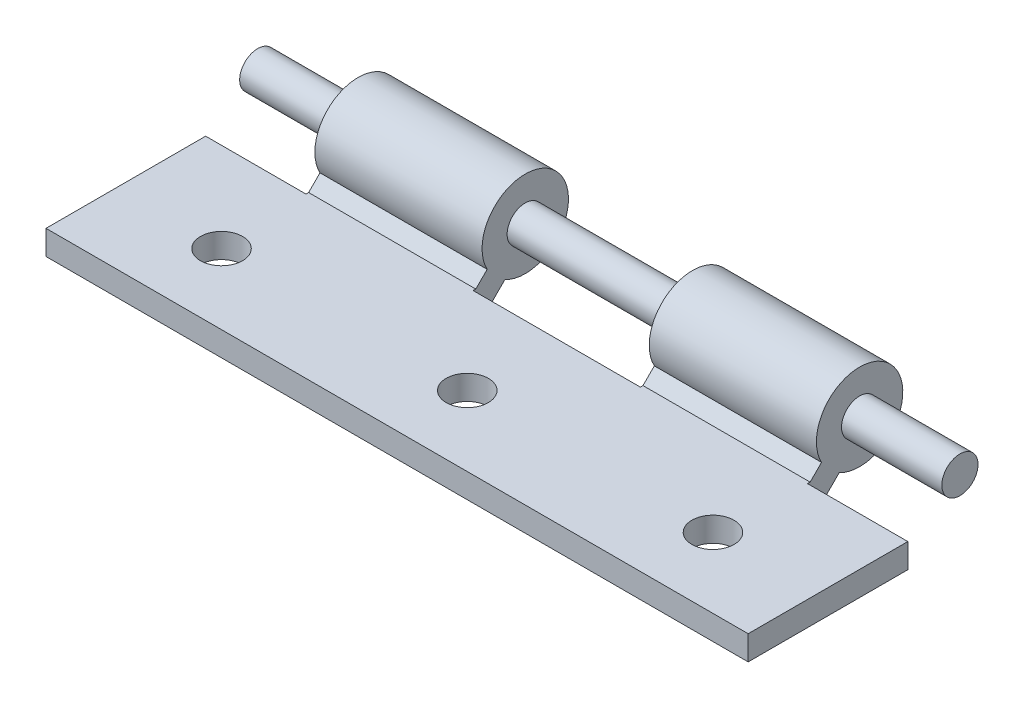
ISO-10303-21;
HEADER;
FILE_DESCRIPTION(('STEP AP214'),'2;1');
FILE_NAME('part.step','',(''),(''),'','','');
FILE_SCHEMA(('AUTOMOTIVE_DESIGN { 1 0 10303 214 1 1 1 1 }'));
ENDSEC;
DATA;
#1=APPLICATION_CONTEXT('core data for automotive mechanical design processes');
#2=APPLICATION_PROTOCOL_DEFINITION('international standard','automotive_design',2000,#1);
#3=PRODUCT_CONTEXT('',#1,'mechanical');
#4=PRODUCT('Part','Part','',(#3));
#5=PRODUCT_RELATED_PRODUCT_CATEGORY('part','',(#4));
#6=PRODUCT_DEFINITION_FORMATION('','',#4);
#7=PRODUCT_DEFINITION_CONTEXT('part definition',#1,'design');
#8=PRODUCT_DEFINITION('design','',#6,#7);
#9=PRODUCT_DEFINITION_SHAPE('','',#8);
#10=(LENGTH_UNIT() NAMED_UNIT(*) SI_UNIT(.MILLI.,.METRE.));
#11=(NAMED_UNIT(*) PLANE_ANGLE_UNIT() SI_UNIT($,.RADIAN.));
#12=(NAMED_UNIT(*) SI_UNIT($,.STERADIAN.) SOLID_ANGLE_UNIT());
#13=UNCERTAINTY_MEASURE_WITH_UNIT(LENGTH_MEASURE(1.E-05),#10,'distance_accuracy_value','');
#14=(GEOMETRIC_REPRESENTATION_CONTEXT(3) GLOBAL_UNCERTAINTY_ASSIGNED_CONTEXT((#13)) GLOBAL_UNIT_ASSIGNED_CONTEXT((#10,
#11,#12)) REPRESENTATION_CONTEXT('',''));
#15=CARTESIAN_POINT('',(0.,0.,0.));
#16=DIRECTION('',(0.,0.,1.));
#17=DIRECTION('',(1.,0.,0.));
#18=AXIS2_PLACEMENT_3D('',#15,#16,#17);
#19=CARTESIAN_POINT('',(50.00625,0.,0.));
#20=DIRECTION('',(-1.,0.,0.));
#21=DIRECTION('',(0.,0.,1.));
#22=AXIS2_PLACEMENT_3D('',#19,#20,#21);
#23=CYLINDRICAL_SURFACE('',#22,2.5796875);
#24=CARTESIAN_POINT('',(50.00625,0.,0.));
#25=DIRECTION('',(1.,0.,0.));
#26=DIRECTION('',(0.,0.,-1.));
#27=AXIS2_PLACEMENT_3D('',#24,#25,#26);
#28=CIRCLE('',#27,2.5796875);
#29=CARTESIAN_POINT('',(50.00625,0.,2.5796875));
#30=VERTEX_POINT('',#29);
#31=EDGE_CURVE('E11',#30,#30,#28,.T.);
#32=CARTESIAN_POINT('',(-50.00625,0.,0.));
#33=DIRECTION('',(1.,0.,0.));
#34=DIRECTION('',(0.,0.,-1.));
#35=AXIS2_PLACEMENT_3D('',#32,#33,#34);
#36=CIRCLE('',#35,2.5796875);
#37=CARTESIAN_POINT('',(-50.00625,0.,2.5796875));
#38=VERTEX_POINT('',#37);
#39=EDGE_CURVE('E43',#38,#38,#36,.T.);
#40=CARTESIAN_POINT('',(50.00625,0.,2.5796875));
#41=CARTESIAN_POINT('',(48.964453125,0.,2.5796875));
#42=CARTESIAN_POINT('',(47.92265625,0.,2.5796875));
#43=CARTESIAN_POINT('',(45.8390625,0.,2.5796875));
#44=CARTESIAN_POINT('',(44.797265625,0.,2.5796875));
#45=CARTESIAN_POINT('',(42.713671875,0.,2.5796875));
#46=CARTESIAN_POINT('',(41.671875,0.,2.5796875));
#47=CARTESIAN_POINT('',(39.58828125,0.,2.5796875));
#48=CARTESIAN_POINT('',(38.546484375,0.,2.5796875));
#49=CARTESIAN_POINT('',(36.462890625,0.,2.5796875));
#50=CARTESIAN_POINT('',(35.42109375,0.,2.5796875));
#51=CARTESIAN_POINT('',(33.3375,0.,2.5796875));
#52=CARTESIAN_POINT('',(32.295703125,0.,2.5796875));
#53=CARTESIAN_POINT('',(30.212109375,0.,2.5796875));
#54=CARTESIAN_POINT('',(29.1703125,0.,2.5796875));
#55=CARTESIAN_POINT('',(27.08671875,0.,2.5796875));
#56=CARTESIAN_POINT('',(26.044921875,0.,2.5796875));
#57=CARTESIAN_POINT('',(23.961328125,0.,2.5796875));
#58=CARTESIAN_POINT('',(22.91953125,0.,2.5796875));
#59=CARTESIAN_POINT('',(20.8359375,0.,2.5796875));
#60=CARTESIAN_POINT('',(19.794140625,0.,2.5796875));
#61=CARTESIAN_POINT('',(17.710546875,0.,2.5796875));
#62=CARTESIAN_POINT('',(16.66875,0.,2.5796875));
#63=CARTESIAN_POINT('',(14.58515625,0.,2.5796875));
#64=CARTESIAN_POINT('',(13.543359375,0.,2.5796875));
#65=CARTESIAN_POINT('',(11.459765625,0.,2.5796875));
#66=CARTESIAN_POINT('',(10.41796875,0.,2.5796875));
#67=CARTESIAN_POINT('',(8.334375,0.,2.5796875));
#68=CARTESIAN_POINT('',(7.292578125,0.,2.5796875));
#69=CARTESIAN_POINT('',(5.208984375,0.,2.5796875));
#70=CARTESIAN_POINT('',(4.1671875,0.,2.5796875));
#71=CARTESIAN_POINT('',(2.08359375,0.,2.5796875));
#72=CARTESIAN_POINT('',(1.041796875,0.,2.5796875));
#73=CARTESIAN_POINT('',(-1.041796875,0.,2.5796875));
#74=CARTESIAN_POINT('',(-2.08359375,0.,2.5796875));
#75=CARTESIAN_POINT('',(-4.1671875,0.,2.5796875));
#76=CARTESIAN_POINT('',(-5.208984375,0.,2.5796875));
#77=CARTESIAN_POINT('',(-7.292578125,0.,2.5796875));
#78=CARTESIAN_POINT('',(-8.334375,0.,2.5796875));
#79=CARTESIAN_POINT('',(-10.41796875,0.,2.5796875));
#80=CARTESIAN_POINT('',(-11.459765625,0.,2.5796875));
#81=CARTESIAN_POINT('',(-13.543359375,0.,2.5796875));
#82=CARTESIAN_POINT('',(-14.58515625,0.,2.5796875));
#83=CARTESIAN_POINT('',(-16.66875,0.,2.5796875));
#84=CARTESIAN_POINT('',(-17.710546875,0.,2.5796875));
#85=CARTESIAN_POINT('',(-19.794140625,0.,2.5796875));
#86=CARTESIAN_POINT('',(-20.8359375,0.,2.5796875));
#87=CARTESIAN_POINT('',(-22.91953125,0.,2.5796875));
#88=CARTESIAN_POINT('',(-23.961328125,0.,2.5796875));
#89=CARTESIAN_POINT('',(-26.044921875,0.,2.5796875));
#90=CARTESIAN_POINT('',(-27.08671875,0.,2.5796875));
#91=CARTESIAN_POINT('',(-29.1703125,0.,2.5796875));
#92=CARTESIAN_POINT('',(-30.212109375,0.,2.5796875));
#93=CARTESIAN_POINT('',(-32.295703125,0.,2.5796875));
#94=CARTESIAN_POINT('',(-33.3375,0.,2.5796875));
#95=CARTESIAN_POINT('',(-35.42109375,0.,2.5796875));
#96=CARTESIAN_POINT('',(-36.462890625,0.,2.5796875));
#97=CARTESIAN_POINT('',(-38.546484375,0.,2.5796875));
#98=CARTESIAN_POINT('',(-39.58828125,0.,2.5796875));
#99=CARTESIAN_POINT('',(-41.671875,0.,2.5796875));
#100=CARTESIAN_POINT('',(-42.713671875,0.,2.5796875));
#101=CARTESIAN_POINT('',(-44.797265625,0.,2.5796875));
#102=CARTESIAN_POINT('',(-45.8390625,0.,2.5796875));
#103=CARTESIAN_POINT('',(-47.92265625,0.,2.5796875));
#104=CARTESIAN_POINT('',(-48.964453125,0.,2.5796875));
#105=CARTESIAN_POINT('',(-50.00625,0.,2.5796875));
#106=B_SPLINE_CURVE_WITH_KNOTS('',3,(#40,#41,#42,#43,#44,#45,#46,#47,#48,#49,#50,#51,#52,#53,
#54,#55,#56,#57,#58,#59,#60,#61,#62,#63,#64,#65,#66,#67,#68,#69,#70,#71,#72,#73,#74,#75,#76,#77,
#78,#79,#80,#81,#82,#83,#84,#85,#86,#87,#88,#89,#90,#91,#92,#93,#94,#95,#96,#97,#98,#99,#100,
#101,#102,#103,#104,#105),.UNSPECIFIED.,.F.,.F.,(4,2,2,2,2,2,2,2,2,2,2,2,2,2,2,2,2,2,2,2,2,2,2,
2,2,2,2,2,2,2,2,2,4),(0.,3.125390625,6.25078125,9.376171875,12.5015625,15.626953125,18.75234375,
21.877734375,25.003125,28.128515625,31.25390625,34.379296875,37.5046875,40.630078125,
43.75546875,46.880859375,50.00625,53.131640625,56.25703125,59.382421875,62.5078125,65.633203125,
68.75859375,71.883984375,75.009375,78.134765625,81.26015625,84.385546875,87.5109375,
90.636328125,93.76171875,96.887109375,100.0125),.UNSPECIFIED.);
#107=EDGE_CURVE('BSEAM40',#30,#38,#106,.T.);
#108=ORIENTED_EDGE('',*,*,#31,.F.);
#109=ORIENTED_EDGE('',*,*,#39,.T.);
#110=ORIENTED_EDGE('',*,*,#107,.T.);
#111=ORIENTED_EDGE('',*,*,#107,.F.);
#112=EDGE_LOOP('',(#108,#110,#109,#111));
#113=FACE_BOUND('',#112,.T.);
#114=ADVANCED_FACE('F40',(#113),#23,.T.);
#115=CARTESIAN_POINT('',(50.00625,0.,0.));
#116=DIRECTION('',(1.,0.,0.));
#117=DIRECTION('',(0.,0.,-1.));
#118=AXIS2_PLACEMENT_3D('',#115,#116,#117);
#119=PLANE('',#118);
#120=ORIENTED_EDGE('',*,*,#31,.T.);
#121=EDGE_LOOP('',(#120));
#122=FACE_BOUND('',#121,.T.);
#123=ADVANCED_FACE('F55',(#122),#119,.T.);
#124=CARTESIAN_POINT('',(-50.00625,0.,0.));
#125=DIRECTION('',(1.,0.,0.));
#126=DIRECTION('',(0.,0.,-1.));
#127=AXIS2_PLACEMENT_3D('',#124,#125,#126);
#128=PLANE('',#127);
#129=ORIENTED_EDGE('',*,*,#39,.F.);
#130=EDGE_LOOP('',(#129));
#131=FACE_BOUND('',#130,.T.);
#132=ADVANCED_FACE('F53',(#131),#128,.F.);
#133=CLOSED_SHELL('',(#114,#123,#132));
#134=MANIFOLD_SOLID_BREP('B2',#133);
#135=CARTESIAN_POINT('',(50.00625,0.,0.));
#136=DIRECTION('',(-1.,0.,0.));
#137=DIRECTION('',(0.,0.,1.));
#138=AXIS2_PLACEMENT_3D('',#135,#136,#137);
#139=CYLINDRICAL_SURFACE('',#138,6.1515625);
#140=CARTESIAN_POINT('',(-11.90625,0.,0.));
#141=DIRECTION('',(-1.,0.,0.));
#142=DIRECTION('',(0.,0.,1.));
#143=AXIS2_PLACEMENT_3D('',#140,#141,#142);
#144=CIRCLE('',#143,6.1515625);
#145=CARTESIAN_POINT('',(-11.90625,-2.89961159914995,5.42530863320063));
#146=VERTEX_POINT('',#145);
#147=CARTESIAN_POINT('',(-11.90625,-5.42530863320065,2.89961159914993));
#148=VERTEX_POINT('',#147);
#149=EDGE_CURVE('E243',#146,#148,#144,.T.);
#150=ORIENTED_EDGE('',*,*,#149,.T.);
#151=DIRECTION('',(-1.,0.,0.));
#152=VECTOR('',#151,1.);
#153=CARTESIAN_POINT('',(50.00625,-5.42530863320065,2.89961159914993));
#154=LINE('',#153,#152);
#155=CARTESIAN_POINT('',(-35.71875,-5.42530863320065,2.89961159914993));
#156=VERTEX_POINT('',#155);
#157=EDGE_CURVE('E105',#148,#156,#154,.T.);
#158=ORIENTED_EDGE('',*,*,#157,.T.);
#159=CARTESIAN_POINT('',(-35.71875,0.,0.));
#160=DIRECTION('',(1.,0.,0.));
#161=DIRECTION('',(0.,0.,-1.));
#162=AXIS2_PLACEMENT_3D('',#159,#160,#161);
#163=CIRCLE('',#162,6.1515625);
#164=CARTESIAN_POINT('',(-35.71875,-2.89961159914995,5.42530863320063));
#165=VERTEX_POINT('',#164);
#166=EDGE_CURVE('E265',#156,#165,#163,.T.);
#167=ORIENTED_EDGE('',*,*,#166,.T.);
#168=DIRECTION('',(-1.,0.,0.));
#169=VECTOR('',#168,1.);
#170=CARTESIAN_POINT('',(50.00625,-2.89961159914995,5.42530863320063));
#171=LINE('',#170,#169);
#172=EDGE_CURVE('E89',#146,#165,#171,.T.);
#173=ORIENTED_EDGE('',*,*,#172,.F.);
#174=EDGE_LOOP('',(#150,#158,#167,#173));
#175=FACE_BOUND('',#174,.T.);
#176=ADVANCED_FACE('F80',(#175),#139,.T.);
#177=CARTESIAN_POINT('',(50.00625,-4.5202,7.04589703405068));
#178=DIRECTION('',(0.,-0.707106781186546,-0.707106781186549));
#179=DIRECTION('',(0.,0.707106781186549,-0.707106781186546));
#180=AXIS2_PLACEMENT_3D('',#177,#178,#179);
#181=PLANE('',#180);
#182=DIRECTION('',(-1.,0.,0.));
#183=VECTOR('',#182,1.);
#184=CARTESIAN_POINT('',(50.00625,-4.5202,7.04589703405068));
#185=LINE('',#184,#183);
#186=CARTESIAN_POINT('',(-11.90625,-4.5202,7.04589703405068));
#187=VERTEX_POINT('',#186);
#188=CARTESIAN_POINT('',(-35.71875,-4.5202,7.04589703405068));
#189=VERTEX_POINT('',#188);
#190=EDGE_CURVE('E329',#187,#189,#185,.T.);
#191=ORIENTED_EDGE('',*,*,#190,.F.);
#192=DIRECTION('',(0.,0.707106781186549,-0.707106781186546));
#193=VECTOR('',#192,1.);
#194=CARTESIAN_POINT('',(-11.90625,-4.5202,7.04589703405068));
#195=LINE('',#194,#193);
#196=EDGE_CURVE('E245',#187,#146,#195,.T.);
#197=ORIENTED_EDGE('',*,*,#196,.T.);
#198=ORIENTED_EDGE('',*,*,#172,.T.);
#199=DIRECTION('',(0.,-0.707106781186549,0.707106781186546));
#200=VECTOR('',#199,1.);
#201=CARTESIAN_POINT('',(-35.71875,-4.5202,7.04589703405068));
#202=LINE('',#201,#200);
#203=EDGE_CURVE('E267',#165,#189,#202,.T.);
#204=ORIENTED_EDGE('',*,*,#203,.T.);
#205=EDGE_LOOP('',(#191,#197,#198,#204));
#206=FACE_BOUND('',#205,.T.);
#207=ADVANCED_FACE('F366',(#206),#181,.F.);
#208=CARTESIAN_POINT('',(50.00625,-8.,5.47430296594927));
#209=DIRECTION('',(0.,0.707106781186546,0.707106781186549));
#210=DIRECTION('',(0.,-0.707106781186549,0.707106781186546));
#211=AXIS2_PLACEMENT_3D('',#208,#209,#210);
#212=PLANE('',#211);
#213=ORIENTED_EDGE('',*,*,#157,.F.);
#214=DIRECTION('',(0.,-0.707106781186549,0.707106781186546));
#215=VECTOR('',#214,1.);
#216=CARTESIAN_POINT('',(-11.90625,-8.,5.47430296594927));
#217=LINE('',#216,#215);
#218=CARTESIAN_POINT('',(-11.90625,-8.,5.47430296594927));
#219=VERTEX_POINT('',#218);
#220=EDGE_CURVE('E241',#148,#219,#217,.T.);
#221=ORIENTED_EDGE('',*,*,#220,.T.);
#222=DIRECTION('',(-1.,0.,0.));
#223=VECTOR('',#222,1.);
#224=CARTESIAN_POINT('',(50.00625,-8.,5.47430296594927));
#225=LINE('',#224,#223);
#226=CARTESIAN_POINT('',(-35.71875,-8.,5.47430296594927));
#227=VERTEX_POINT('',#226);
#228=EDGE_CURVE('E220',#219,#227,#225,.T.);
#229=ORIENTED_EDGE('',*,*,#228,.T.);
#230=DIRECTION('',(0.,0.707106781186549,-0.707106781186546));
#231=VECTOR('',#230,1.);
#232=CARTESIAN_POINT('',(-35.71875,-8.,5.47430296594927));
#233=LINE('',#232,#231);
#234=EDGE_CURVE('E262',#227,#156,#233,.T.);
#235=ORIENTED_EDGE('',*,*,#234,.T.);
#236=EDGE_LOOP('',(#213,#221,#229,#235));
#237=FACE_BOUND('',#236,.T.);
#238=ADVANCED_FACE('F370',(#237),#212,.F.);
#239=CARTESIAN_POINT('',(50.00625,0.,0.));
#240=DIRECTION('',(-1.,0.,0.));
#241=DIRECTION('',(0.,0.,1.));
#242=AXIS2_PLACEMENT_3D('',#239,#240,#241);
#243=CYLINDRICAL_SURFACE('',#242,2.5796875);
#244=CARTESIAN_POINT('',(-11.90625,0.,0.));
#245=DIRECTION('',(-1.,0.,0.));
#246=DIRECTION('',(0.,0.,1.));
#247=AXIS2_PLACEMENT_3D('',#244,#245,#246);
#248=CIRCLE('',#247,2.5796875);
#249=CARTESIAN_POINT('',(-11.90625,0.,2.5796875));
#250=VERTEX_POINT('',#249);
#251=EDGE_CURVE('E240',#250,#250,#248,.T.);
#252=CARTESIAN_POINT('',(-35.71875,0.,0.));
#253=DIRECTION('',(1.,0.,0.));
#254=DIRECTION('',(0.,0.,-1.));
#255=AXIS2_PLACEMENT_3D('',#252,#253,#254);
#256=CIRCLE('',#255,2.5796875);
#257=CARTESIAN_POINT('',(-35.71875,0.,2.5796875));
#258=VERTEX_POINT('',#257);
#259=EDGE_CURVE('E260',#258,#258,#256,.T.);
#260=CARTESIAN_POINT('',(-11.90625,0.,2.5796875));
#261=CARTESIAN_POINT('',(-12.154296875,0.,2.5796875));
#262=CARTESIAN_POINT('',(-12.40234375,0.,2.5796875));
#263=CARTESIAN_POINT('',(-12.8984375,0.,2.5796875));
#264=CARTESIAN_POINT('',(-13.146484375,0.,2.5796875));
#265=CARTESIAN_POINT('',(-13.642578125,0.,2.5796875));
#266=CARTESIAN_POINT('',(-13.890625,0.,2.5796875));
#267=CARTESIAN_POINT('',(-14.38671875,0.,2.5796875));
#268=CARTESIAN_POINT('',(-14.634765625,0.,2.5796875));
#269=CARTESIAN_POINT('',(-15.130859375,0.,2.5796875));
#270=CARTESIAN_POINT('',(-15.37890625,0.,2.5796875));
#271=CARTESIAN_POINT('',(-15.875,0.,2.5796875));
#272=CARTESIAN_POINT('',(-16.123046875,0.,2.5796875));
#273=CARTESIAN_POINT('',(-16.619140625,0.,2.5796875));
#274=CARTESIAN_POINT('',(-16.8671875,0.,2.5796875));
#275=CARTESIAN_POINT('',(-17.36328125,0.,2.5796875));
#276=CARTESIAN_POINT('',(-17.611328125,0.,2.5796875));
#277=CARTESIAN_POINT('',(-18.107421875,0.,2.5796875));
#278=CARTESIAN_POINT('',(-18.35546875,0.,2.5796875));
#279=CARTESIAN_POINT('',(-18.8515625,0.,2.5796875));
#280=CARTESIAN_POINT('',(-19.099609375,0.,2.5796875));
#281=CARTESIAN_POINT('',(-19.595703125,0.,2.5796875));
#282=CARTESIAN_POINT('',(-19.84375,0.,2.5796875));
#283=CARTESIAN_POINT('',(-20.33984375,0.,2.5796875));
#284=CARTESIAN_POINT('',(-20.587890625,0.,2.5796875));
#285=CARTESIAN_POINT('',(-21.083984375,0.,2.5796875));
#286=CARTESIAN_POINT('',(-21.33203125,0.,2.5796875));
#287=CARTESIAN_POINT('',(-21.828125,0.,2.5796875));
#288=CARTESIAN_POINT('',(-22.076171875,0.,2.5796875));
#289=CARTESIAN_POINT('',(-22.572265625,0.,2.5796875));
#290=CARTESIAN_POINT('',(-22.8203125,0.,2.5796875));
#291=CARTESIAN_POINT('',(-23.31640625,0.,2.5796875));
#292=CARTESIAN_POINT('',(-23.564453125,0.,2.5796875));
#293=CARTESIAN_POINT('',(-24.060546875,0.,2.5796875));
#294=CARTESIAN_POINT('',(-24.30859375,0.,2.5796875));
#295=CARTESIAN_POINT('',(-24.8046875,0.,2.5796875));
#296=CARTESIAN_POINT('',(-25.052734375,0.,2.5796875));
#297=CARTESIAN_POINT('',(-25.548828125,0.,2.5796875));
#298=CARTESIAN_POINT('',(-25.796875,0.,2.5796875));
#299=CARTESIAN_POINT('',(-26.29296875,0.,2.5796875));
#300=CARTESIAN_POINT('',(-26.541015625,0.,2.5796875));
#301=CARTESIAN_POINT('',(-27.037109375,0.,2.5796875));
#302=CARTESIAN_POINT('',(-27.28515625,0.,2.5796875));
#303=CARTESIAN_POINT('',(-27.78125,0.,2.5796875));
#304=CARTESIAN_POINT('',(-28.029296875,0.,2.5796875));
#305=CARTESIAN_POINT('',(-28.525390625,0.,2.5796875));
#306=CARTESIAN_POINT('',(-28.7734375,0.,2.5796875));
#307=CARTESIAN_POINT('',(-29.26953125,0.,2.5796875));
#308=CARTESIAN_POINT('',(-29.517578125,0.,2.5796875));
#309=CARTESIAN_POINT('',(-30.013671875,0.,2.5796875));
#310=CARTESIAN_POINT('',(-30.26171875,0.,2.5796875));
#311=CARTESIAN_POINT('',(-30.7578125,0.,2.5796875));
#312=CARTESIAN_POINT('',(-31.005859375,0.,2.5796875));
#313=CARTESIAN_POINT('',(-31.501953125,0.,2.5796875));
#314=CARTESIAN_POINT('',(-31.75,0.,2.5796875));
#315=CARTESIAN_POINT('',(-32.24609375,0.,2.5796875));
#316=CARTESIAN_POINT('',(-32.494140625,0.,2.5796875));
#317=CARTESIAN_POINT('',(-32.990234375,0.,2.5796875));
#318=CARTESIAN_POINT('',(-33.23828125,0.,2.5796875));
#319=CARTESIAN_POINT('',(-33.734375,0.,2.5796875));
#320=CARTESIAN_POINT('',(-33.982421875,0.,2.5796875));
#321=CARTESIAN_POINT('',(-34.478515625,0.,2.5796875));
#322=CARTESIAN_POINT('',(-34.7265625,0.,2.5796875));
#323=CARTESIAN_POINT('',(-35.22265625,0.,2.5796875));
#324=CARTESIAN_POINT('',(-35.470703125,0.,2.5796875));
#325=CARTESIAN_POINT('',(-35.71875,0.,2.5796875));
#326=B_SPLINE_CURVE_WITH_KNOTS('',3,(#260,#261,#262,#263,#264,#265,#266,#267,#268,#269,#270,
#271,#272,#273,#274,#275,#276,#277,#278,#279,#280,#281,#282,#283,#284,#285,#286,#287,#288,#289,
#290,#291,#292,#293,#294,#295,#296,#297,#298,#299,#300,#301,#302,#303,#304,#305,#306,#307,#308,
#309,#310,#311,#312,#313,#314,#315,#316,#317,#318,#319,#320,#321,#322,#323,#324,#325),
.UNSPECIFIED.,.F.,.F.,(4,2,2,2,2,2,2,2,2,2,2,2,2,2,2,2,2,2,2,2,2,2,2,2,2,2,2,2,2,2,2,2,4),(0.,
0.744140624999994,1.48828124999999,2.23242187499999,2.97656249999999,3.720703125,4.46484375,
5.208984375,5.953125,6.697265625,7.44140625,8.185546875,8.9296875,9.673828125,10.41796875,
11.162109375,11.90625,12.650390625,13.39453125,14.138671875,14.8828125,15.626953125,16.37109375,
17.115234375,17.859375,18.603515625,19.34765625,20.091796875,20.8359375,21.580078125,
22.32421875,23.068359375,23.8125),.UNSPECIFIED.);
#327=EDGE_CURVE('BSEAM437',#250,#258,#326,.T.);
#328=ORIENTED_EDGE('',*,*,#251,.F.);
#329=ORIENTED_EDGE('',*,*,#259,.F.);
#330=ORIENTED_EDGE('',*,*,#327,.T.);
#331=ORIENTED_EDGE('',*,*,#327,.F.);
#332=EDGE_LOOP('',(#328,#330,#329,#331));
#333=FACE_BOUND('',#332,.T.);
#334=ADVANCED_FACE('F437',(#333),#243,.F.);
#335=CARTESIAN_POINT('',(50.00625,0.,0.));
#336=DIRECTION('',(1.,0.,0.));
#337=DIRECTION('',(0.,0.,-1.));
#338=AXIS2_PLACEMENT_3D('',#335,#336,#337);
#339=PLANE('',#338);
#340=DIRECTION('',(0.,1.,0.));
#341=VECTOR('',#340,1.);
#342=CARTESIAN_POINT('',(50.00625,-8.,7.4215625));
#343=LINE('',#342,#341);
#344=CARTESIAN_POINT('',(50.00625,-8.,7.4215625));
#345=VERTEX_POINT('',#344);
#346=CARTESIAN_POINT('',(50.00625,-4.5202,7.4215625));
#347=VERTEX_POINT('',#346);
#348=EDGE_CURVE('E283',#345,#347,#343,.T.);
#349=ORIENTED_EDGE('',*,*,#348,.T.);
#350=DIRECTION('',(0.,0.,1.));
#351=VECTOR('',#350,1.);
#352=CARTESIAN_POINT('',(50.00625,-4.5202,30.1625));
#353=LINE('',#352,#351);
#354=CARTESIAN_POINT('',(50.00625,-4.5202,30.1625));
#355=VERTEX_POINT('',#354);
#356=EDGE_CURVE('E304',#347,#355,#353,.T.);
#357=ORIENTED_EDGE('',*,*,#356,.T.);
#358=DIRECTION('',(0.,-1.,0.));
#359=VECTOR('',#358,1.);
#360=CARTESIAN_POINT('',(50.00625,-4.5202,30.1625));
#361=LINE('',#360,#359);
#362=CARTESIAN_POINT('',(50.00625,-8.,30.1625));
#363=VERTEX_POINT('',#362);
#364=EDGE_CURVE('E306',#355,#363,#361,.T.);
#365=ORIENTED_EDGE('',*,*,#364,.T.);
#366=DIRECTION('',(0.,0.,-1.));
#367=VECTOR('',#366,1.);
#368=CARTESIAN_POINT('',(50.00625,-8.,5.47430296594927));
#369=LINE('',#368,#367);
#370=EDGE_CURVE('E309',#363,#345,#369,.T.);
#371=ORIENTED_EDGE('',*,*,#370,.T.);
#372=EDGE_LOOP('',(#349,#357,#365,#371));
#373=FACE_BOUND('',#372,.T.);
#374=ADVANCED_FACE('F382',(#373),#339,.T.);
#375=CARTESIAN_POINT('',(-50.00625,0.,0.));
#376=DIRECTION('',(1.,0.,0.));
#377=DIRECTION('',(0.,0.,-1.));
#378=AXIS2_PLACEMENT_3D('',#375,#376,#377);
#379=PLANE('',#378);
#380=DIRECTION('',(0.,0.,1.));
#381=VECTOR('',#380,1.);
#382=CARTESIAN_POINT('',(-50.00625,-4.5202,30.1625));
#383=LINE('',#382,#381);
#384=CARTESIAN_POINT('',(-50.00625,-4.5202,7.4215625));
#385=VERTEX_POINT('',#384);
#386=CARTESIAN_POINT('',(-50.00625,-4.5202,30.1625));
#387=VERTEX_POINT('',#386);
#388=EDGE_CURVE('E303',#385,#387,#383,.T.);
#389=ORIENTED_EDGE('',*,*,#388,.F.);
#390=DIRECTION('',(0.,1.,0.));
#391=VECTOR('',#390,1.);
#392=CARTESIAN_POINT('',(-50.00625,-8.,7.4215625));
#393=LINE('',#392,#391);
#394=CARTESIAN_POINT('',(-50.00625,-8.,7.4215625));
#395=VERTEX_POINT('',#394);
#396=EDGE_CURVE('E256',#395,#385,#393,.T.);
#397=ORIENTED_EDGE('',*,*,#396,.F.);
#398=DIRECTION('',(0.,0.,-1.));
#399=VECTOR('',#398,1.);
#400=CARTESIAN_POINT('',(-50.00625,-8.,5.47430296594927));
#401=LINE('',#400,#399);
#402=CARTESIAN_POINT('',(-50.00625,-8.,30.1625));
#403=VERTEX_POINT('',#402);
#404=EDGE_CURVE('E307',#403,#395,#401,.T.);
#405=ORIENTED_EDGE('',*,*,#404,.F.);
#406=DIRECTION('',(0.,-1.,0.));
#407=VECTOR('',#406,1.);
#408=CARTESIAN_POINT('',(-50.00625,-4.5202,30.1625));
#409=LINE('',#408,#407);
#410=EDGE_CURVE('E313',#387,#403,#409,.T.);
#411=ORIENTED_EDGE('',*,*,#410,.F.);
#412=EDGE_LOOP('',(#389,#397,#405,#411));
#413=FACE_BOUND('',#412,.T.);
#414=ADVANCED_FACE('F374',(#413),#379,.F.);
#415=CARTESIAN_POINT('',(11.90625,0.,0.));
#416=DIRECTION('',(1.,0.,0.));
#417=DIRECTION('',(0.,0.,-1.));
#418=AXIS2_PLACEMENT_3D('',#415,#416,#417);
#419=CIRCLE('',#418,6.1515625);
#420=CARTESIAN_POINT('',(11.90625,-5.42530863320065,2.89961159914993));
#421=VERTEX_POINT('',#420);
#422=CARTESIAN_POINT('',(11.90625,-2.89961159914995,5.42530863320063));
#423=VERTEX_POINT('',#422);
#424=EDGE_CURVE('E97',#421,#423,#419,.T.);
#425=ORIENTED_EDGE('',*,*,#424,.T.);
#426=CARTESIAN_POINT('',(35.71875,-2.89961159914995,5.42530863320063));
#427=VERTEX_POINT('',#426);
#428=EDGE_CURVE('E38',#427,#423,#171,.T.);
#429=ORIENTED_EDGE('',*,*,#428,.F.);
#430=CARTESIAN_POINT('',(35.71875,0.,0.));
#431=DIRECTION('',(-1.,0.,0.));
#432=DIRECTION('',(0.,0.,1.));
#433=AXIS2_PLACEMENT_3D('',#430,#431,#432);
#434=CIRCLE('',#433,6.1515625);
#435=CARTESIAN_POINT('',(35.71875,-5.42530863320065,2.89961159914993));
#436=VERTEX_POINT('',#435);
#437=EDGE_CURVE('E292',#427,#436,#434,.T.);
#438=ORIENTED_EDGE('',*,*,#437,.T.);
#439=EDGE_CURVE('E317',#436,#421,#154,.T.);
#440=ORIENTED_EDGE('',*,*,#439,.T.);
#441=EDGE_LOOP('',(#425,#429,#438,#440));
#442=FACE_BOUND('',#441,.T.);
#443=ADVANCED_FACE('F82',(#442),#139,.T.);
#444=ORIENTED_EDGE('',*,*,#428,.T.);
#445=DIRECTION('',(0.,-0.707106781186549,0.707106781186546));
#446=VECTOR('',#445,1.);
#447=CARTESIAN_POINT('',(11.90625,-4.5202,7.04589703405068));
#448=LINE('',#447,#446);
#449=CARTESIAN_POINT('',(11.90625,-4.5202,7.04589703405068));
#450=VERTEX_POINT('',#449);
#451=EDGE_CURVE('E234',#423,#450,#448,.T.);
#452=ORIENTED_EDGE('',*,*,#451,.T.);
#453=CARTESIAN_POINT('',(35.71875,-4.5202,7.04589703405068));
#454=VERTEX_POINT('',#453);
#455=EDGE_CURVE('E330',#454,#450,#185,.T.);
#456=ORIENTED_EDGE('',*,*,#455,.F.);
#457=DIRECTION('',(0.,0.707106781186549,-0.707106781186546));
#458=VECTOR('',#457,1.);
#459=CARTESIAN_POINT('',(35.71875,-4.5202,7.04589703405068));
#460=LINE('',#459,#458);
#461=EDGE_CURVE('E294',#454,#427,#460,.T.);
#462=ORIENTED_EDGE('',*,*,#461,.T.);
#463=EDGE_LOOP('',(#444,#452,#456,#462));
#464=FACE_BOUND('',#463,.T.);
#465=ADVANCED_FACE('F372',(#464),#181,.F.);
#466=CARTESIAN_POINT('',(50.00625,-4.5202,30.1625));
#467=DIRECTION('',(0.,-1.,0.));
#468=DIRECTION('',(0.,0.,-1.));
#469=AXIS2_PLACEMENT_3D('',#466,#467,#468);
#470=PLANE('',#469);
#471=CARTESIAN_POINT('',(-35.00625,-4.5202,20.1625));
#472=DIRECTION('',(0.,1.,0.));
#473=DIRECTION('',(0.,0.,1.));
#474=AXIS2_PLACEMENT_3D('',#471,#472,#473);
#475=CIRCLE('',#474,3.);
#476=CARTESIAN_POINT('',(-35.00625,-4.5202,23.1625));
#477=VERTEX_POINT('',#476);
#478=EDGE_CURVE('E343',#477,#477,#475,.T.);
#479=ORIENTED_EDGE('',*,*,#478,.F.);
#480=EDGE_LOOP('',(#479));
#481=FACE_BOUND('',#480,.T.);
#482=CARTESIAN_POINT('',(-0.00624999999999237,-4.5202,20.1625));
#483=DIRECTION('',(0.,1.,0.));
#484=DIRECTION('',(0.,0.,1.));
#485=AXIS2_PLACEMENT_3D('',#482,#483,#484);
#486=CIRCLE('',#485,3.);
#487=CARTESIAN_POINT('',(-0.00624999999999237,-4.5202,23.1625));
#488=VERTEX_POINT('',#487);
#489=EDGE_CURVE('E608',#488,#488,#486,.T.);
#490=ORIENTED_EDGE('',*,*,#489,.F.);
#491=EDGE_LOOP('',(#490));
#492=FACE_BOUND('',#491,.T.);
#493=CARTESIAN_POINT('',(34.99375,-4.5202,20.1625));
#494=DIRECTION('',(0.,1.,0.));
#495=DIRECTION('',(0.,0.,1.));
#496=AXIS2_PLACEMENT_3D('',#493,#494,#495);
#497=CIRCLE('',#496,3.);
#498=CARTESIAN_POINT('',(34.99375,-4.5202,23.1625));
#499=VERTEX_POINT('',#498);
#500=EDGE_CURVE('E225',#499,#499,#497,.T.);
#501=ORIENTED_EDGE('',*,*,#500,.F.);
#502=EDGE_LOOP('',(#501));
#503=FACE_BOUND('',#502,.T.);
#504=DIRECTION('',(-1.,0.,0.));
#505=VECTOR('',#504,1.);
#506=CARTESIAN_POINT('',(50.00625,-4.5202,7.4215625));
#507=LINE('',#506,#505);
#508=CARTESIAN_POINT('',(11.90625,-4.5202,7.4215625));
#509=VERTEX_POINT('',#508);
#510=CARTESIAN_POINT('',(-11.90625,-4.5202,7.4215625));
#511=VERTEX_POINT('',#510);
#512=EDGE_CURVE('E249',#509,#511,#507,.T.);
#513=ORIENTED_EDGE('',*,*,#512,.T.);
#514=DIRECTION('',(0.,0.,-1.));
#515=VECTOR('',#514,1.);
#516=CARTESIAN_POINT('',(-11.90625,-4.5202,30.1625));
#517=LINE('',#516,#515);
#518=EDGE_CURVE('E203',#511,#187,#517,.T.);
#519=ORIENTED_EDGE('',*,*,#518,.T.);
#520=ORIENTED_EDGE('',*,*,#190,.T.);
#521=DIRECTION('',(0.,0.,1.));
#522=VECTOR('',#521,1.);
#523=CARTESIAN_POINT('',(-35.71875,-4.5202,30.1625));
#524=LINE('',#523,#522);
#525=CARTESIAN_POINT('',(-35.71875,-4.5202,7.4215625));
#526=VERTEX_POINT('',#525);
#527=EDGE_CURVE('E270',#189,#526,#524,.T.);
#528=ORIENTED_EDGE('',*,*,#527,.T.);
#529=DIRECTION('',(-1.,0.,0.));
#530=VECTOR('',#529,1.);
#531=CARTESIAN_POINT('',(50.00625,-4.5202,7.4215625));
#532=LINE('',#531,#530);
#533=EDGE_CURVE('E273',#526,#385,#532,.T.);
#534=ORIENTED_EDGE('',*,*,#533,.T.);
#535=ORIENTED_EDGE('',*,*,#388,.T.);
#536=DIRECTION('',(-1.,0.,0.));
#537=VECTOR('',#536,1.);
#538=CARTESIAN_POINT('',(50.00625,-4.5202,30.1625));
#539=LINE('',#538,#537);
#540=EDGE_CURVE('E326',#355,#387,#539,.T.);
#541=ORIENTED_EDGE('',*,*,#540,.F.);
#542=ORIENTED_EDGE('',*,*,#356,.F.);
#543=DIRECTION('',(-1.,0.,0.));
#544=VECTOR('',#543,1.);
#545=CARTESIAN_POINT('',(50.00625,-4.5202,7.4215625));
#546=LINE('',#545,#544);
#547=CARTESIAN_POINT('',(35.71875,-4.5202,7.4215625));
#548=VERTEX_POINT('',#547);
#549=EDGE_CURVE('E300',#347,#548,#546,.T.);
#550=ORIENTED_EDGE('',*,*,#549,.T.);
#551=DIRECTION('',(0.,0.,-1.));
#552=VECTOR('',#551,1.);
#553=CARTESIAN_POINT('',(35.71875,-4.5202,30.1625));
#554=LINE('',#553,#552);
#555=EDGE_CURVE('E297',#548,#454,#554,.T.);
#556=ORIENTED_EDGE('',*,*,#555,.T.);
#557=ORIENTED_EDGE('',*,*,#455,.T.);
#558=DIRECTION('',(0.,0.,1.));
#559=VECTOR('',#558,1.);
#560=CARTESIAN_POINT('',(11.90625,-4.5202,30.1625));
#561=LINE('',#560,#559);
#562=EDGE_CURVE('E237',#450,#509,#561,.T.);
#563=ORIENTED_EDGE('',*,*,#562,.T.);
#564=EDGE_LOOP('',(#513,#519,#520,#528,#534,#535,#541,#542,#550,#556,#557,#563));
#565=FACE_BOUND('',#564,.T.);
#566=ADVANCED_FACE('F380',(#481,#492,#503,#565),#470,.F.);
#567=CARTESIAN_POINT('',(50.00625,-4.5202,30.1625));
#568=DIRECTION('',(0.,0.,-1.));
#569=DIRECTION('',(-1.,0.,0.));
#570=AXIS2_PLACEMENT_3D('',#567,#568,#569);
#571=PLANE('',#570);
#572=ORIENTED_EDGE('',*,*,#410,.T.);
#573=DIRECTION('',(-1.,0.,0.));
#574=VECTOR('',#573,1.);
#575=CARTESIAN_POINT('',(50.00625,-8.,30.1625));
#576=LINE('',#575,#574);
#577=EDGE_CURVE('E323',#363,#403,#576,.T.);
#578=ORIENTED_EDGE('',*,*,#577,.F.);
#579=ORIENTED_EDGE('',*,*,#364,.F.);
#580=ORIENTED_EDGE('',*,*,#540,.T.);
#581=EDGE_LOOP('',(#572,#578,#579,#580));
#582=FACE_BOUND('',#581,.T.);
#583=ADVANCED_FACE('F418',(#582),#571,.F.);
#584=CARTESIAN_POINT('',(50.00625,-8.,5.47430296594927));
#585=DIRECTION('',(0.,1.,0.));
#586=DIRECTION('',(0.,0.,1.));
#587=AXIS2_PLACEMENT_3D('',#584,#585,#586);
#588=PLANE('',#587);
#589=CARTESIAN_POINT('',(-35.00625,-8.,20.1625));
#590=DIRECTION('',(0.,1.,0.));
#591=DIRECTION('',(0.,0.,1.));
#592=AXIS2_PLACEMENT_3D('',#589,#590,#591);
#593=CIRCLE('',#592,3.);
#594=CARTESIAN_POINT('',(-35.00625,-8.,23.1625));
#595=VERTEX_POINT('',#594);
#596=EDGE_CURVE('E84',#595,#595,#593,.T.);
#597=ORIENTED_EDGE('',*,*,#596,.T.);
#598=EDGE_LOOP('',(#597));
#599=FACE_BOUND('',#598,.T.);
#600=CARTESIAN_POINT('',(-0.00624999999999237,-8.,20.1625));
#601=DIRECTION('',(0.,1.,0.));
#602=DIRECTION('',(0.,0.,1.));
#603=AXIS2_PLACEMENT_3D('',#600,#601,#602);
#604=CIRCLE('',#603,3.);
#605=CARTESIAN_POINT('',(-0.00624999999999237,-8.,23.1625));
#606=VERTEX_POINT('',#605);
#607=EDGE_CURVE('E223',#606,#606,#604,.T.);
#608=ORIENTED_EDGE('',*,*,#607,.T.);
#609=EDGE_LOOP('',(#608));
#610=FACE_BOUND('',#609,.T.);
#611=CARTESIAN_POINT('',(34.99375,-8.,20.1625));
#612=DIRECTION('',(0.,1.,0.));
#613=DIRECTION('',(0.,0.,1.));
#614=AXIS2_PLACEMENT_3D('',#611,#612,#613);
#615=CIRCLE('',#614,3.);
#616=CARTESIAN_POINT('',(34.99375,-8.,23.1625));
#617=VERTEX_POINT('',#616);
#618=EDGE_CURVE('E341',#617,#617,#615,.T.);
#619=ORIENTED_EDGE('',*,*,#618,.T.);
#620=EDGE_LOOP('',(#619));
#621=FACE_BOUND('',#620,.T.);
#622=ORIENTED_EDGE('',*,*,#228,.F.);
#623=DIRECTION('',(0.,0.,1.));
#624=VECTOR('',#623,1.);
#625=CARTESIAN_POINT('',(-11.90625,-8.,-6.1515625));
#626=LINE('',#625,#624);
#627=CARTESIAN_POINT('',(-11.90625,-8.,7.4215625));
#628=VERTEX_POINT('',#627);
#629=EDGE_CURVE('E200',#219,#628,#626,.T.);
#630=ORIENTED_EDGE('',*,*,#629,.T.);
#631=DIRECTION('',(1.,0.,0.));
#632=VECTOR('',#631,1.);
#633=CARTESIAN_POINT('',(-11.90625,-8.,7.4215625));
#634=LINE('',#633,#632);
#635=CARTESIAN_POINT('',(11.90625,-8.,7.4215625));
#636=VERTEX_POINT('',#635);
#637=EDGE_CURVE('E210',#628,#636,#634,.T.);
#638=ORIENTED_EDGE('',*,*,#637,.T.);
#639=DIRECTION('',(0.,0.,-1.));
#640=VECTOR('',#639,1.);
#641=CARTESIAN_POINT('',(11.90625,-8.,-6.1515625));
#642=LINE('',#641,#640);
#643=CARTESIAN_POINT('',(11.90625,-8.,5.47430296594927));
#644=VERTEX_POINT('',#643);
#645=EDGE_CURVE('E207',#636,#644,#642,.T.);
#646=ORIENTED_EDGE('',*,*,#645,.T.);
#647=CARTESIAN_POINT('',(35.71875,-8.,5.47430296594927));
#648=VERTEX_POINT('',#647);
#649=EDGE_CURVE('E320',#648,#644,#225,.T.);
#650=ORIENTED_EDGE('',*,*,#649,.F.);
#651=DIRECTION('',(0.,0.,1.));
#652=VECTOR('',#651,1.);
#653=CARTESIAN_POINT('',(35.71875,-8.,7.4215625));
#654=LINE('',#653,#652);
#655=CARTESIAN_POINT('',(35.71875,-8.,7.4215625));
#656=VERTEX_POINT('',#655);
#657=EDGE_CURVE('E276',#648,#656,#654,.T.);
#658=ORIENTED_EDGE('',*,*,#657,.T.);
#659=DIRECTION('',(1.,0.,0.));
#660=VECTOR('',#659,1.);
#661=CARTESIAN_POINT('',(50.00625,-8.,7.4215625));
#662=LINE('',#661,#660);
#663=EDGE_CURVE('E279',#656,#345,#662,.T.);
#664=ORIENTED_EDGE('',*,*,#663,.T.);
#665=ORIENTED_EDGE('',*,*,#370,.F.);
#666=ORIENTED_EDGE('',*,*,#577,.T.);
#667=ORIENTED_EDGE('',*,*,#404,.T.);
#668=DIRECTION('',(1.,0.,0.));
#669=VECTOR('',#668,1.);
#670=CARTESIAN_POINT('',(-50.00625,-8.,7.4215625));
#671=LINE('',#670,#669);
#672=CARTESIAN_POINT('',(-35.71875,-8.,7.4215625));
#673=VERTEX_POINT('',#672);
#674=EDGE_CURVE('E251',#395,#673,#671,.T.);
#675=ORIENTED_EDGE('',*,*,#674,.T.);
#676=DIRECTION('',(0.,0.,-1.));
#677=VECTOR('',#676,1.);
#678=CARTESIAN_POINT('',(-35.71875,-8.,7.4215625));
#679=LINE('',#678,#677);
#680=EDGE_CURVE('E254',#673,#227,#679,.T.);
#681=ORIENTED_EDGE('',*,*,#680,.T.);
#682=EDGE_LOOP('',(#622,#630,#638,#646,#650,#658,#664,#665,#666,#667,#675,#681));
#683=FACE_BOUND('',#682,.T.);
#684=ADVANCED_FACE('F218',(#599,#610,#621,#683),#588,.F.);
#685=ORIENTED_EDGE('',*,*,#649,.T.);
#686=DIRECTION('',(0.,0.707106781186549,-0.707106781186546));
#687=VECTOR('',#686,1.);
#688=CARTESIAN_POINT('',(11.90625,-8.,5.47430296594927));
#689=LINE('',#688,#687);
#690=EDGE_CURVE('E231',#644,#421,#689,.T.);
#691=ORIENTED_EDGE('',*,*,#690,.T.);
#692=ORIENTED_EDGE('',*,*,#439,.F.);
#693=DIRECTION('',(0.,-0.707106781186549,0.707106781186546));
#694=VECTOR('',#693,1.);
#695=CARTESIAN_POINT('',(35.71875,-8.,5.47430296594927));
#696=LINE('',#695,#694);
#697=EDGE_CURVE('E289',#436,#648,#696,.T.);
#698=ORIENTED_EDGE('',*,*,#697,.T.);
#699=EDGE_LOOP('',(#685,#691,#692,#698));
#700=FACE_BOUND('',#699,.T.);
#701=ADVANCED_FACE('F404',(#700),#212,.F.);
#702=CARTESIAN_POINT('',(11.90625,0.,0.));
#703=DIRECTION('',(1.,0.,0.));
#704=DIRECTION('',(0.,0.,-1.));
#705=AXIS2_PLACEMENT_3D('',#702,#703,#704);
#706=CIRCLE('',#705,2.5796875);
#707=CARTESIAN_POINT('',(11.90625,0.,2.5796875));
#708=VERTEX_POINT('',#707);
#709=EDGE_CURVE('E229',#708,#708,#706,.T.);
#710=CARTESIAN_POINT('',(35.71875,0.,0.));
#711=DIRECTION('',(-1.,0.,0.));
#712=DIRECTION('',(0.,0.,1.));
#713=AXIS2_PLACEMENT_3D('',#710,#711,#712);
#714=CIRCLE('',#713,2.5796875);
#715=CARTESIAN_POINT('',(35.71875,0.,2.5796875));
#716=VERTEX_POINT('',#715);
#717=EDGE_CURVE('E286',#716,#716,#714,.T.);
#718=CARTESIAN_POINT('',(11.90625,0.,2.5796875));
#719=CARTESIAN_POINT('',(12.154296875,0.,2.5796875));
#720=CARTESIAN_POINT('',(12.40234375,0.,2.5796875));
#721=CARTESIAN_POINT('',(12.8984375,0.,2.5796875));
#722=CARTESIAN_POINT('',(13.146484375,0.,2.5796875));
#723=CARTESIAN_POINT('',(13.642578125,0.,2.5796875));
#724=CARTESIAN_POINT('',(13.890625,0.,2.5796875));
#725=CARTESIAN_POINT('',(14.38671875,0.,2.5796875));
#726=CARTESIAN_POINT('',(14.634765625,0.,2.5796875));
#727=CARTESIAN_POINT('',(15.130859375,0.,2.5796875));
#728=CARTESIAN_POINT('',(15.37890625,0.,2.5796875));
#729=CARTESIAN_POINT('',(15.875,0.,2.5796875));
#730=CARTESIAN_POINT('',(16.123046875,0.,2.5796875));
#731=CARTESIAN_POINT('',(16.619140625,0.,2.5796875));
#732=CARTESIAN_POINT('',(16.8671875,0.,2.5796875));
#733=CARTESIAN_POINT('',(17.36328125,0.,2.5796875));
#734=CARTESIAN_POINT('',(17.611328125,0.,2.5796875));
#735=CARTESIAN_POINT('',(18.107421875,0.,2.5796875));
#736=CARTESIAN_POINT('',(18.35546875,0.,2.5796875));
#737=CARTESIAN_POINT('',(18.8515625,0.,2.5796875));
#738=CARTESIAN_POINT('',(19.099609375,0.,2.5796875));
#739=CARTESIAN_POINT('',(19.595703125,0.,2.5796875));
#740=CARTESIAN_POINT('',(19.84375,0.,2.5796875));
#741=CARTESIAN_POINT('',(20.33984375,0.,2.5796875));
#742=CARTESIAN_POINT('',(20.587890625,0.,2.5796875));
#743=CARTESIAN_POINT('',(21.083984375,0.,2.5796875));
#744=CARTESIAN_POINT('',(21.33203125,0.,2.5796875));
#745=CARTESIAN_POINT('',(21.828125,0.,2.5796875));
#746=CARTESIAN_POINT('',(22.076171875,0.,2.5796875));
#747=CARTESIAN_POINT('',(22.572265625,0.,2.5796875));
#748=CARTESIAN_POINT('',(22.8203125,0.,2.5796875));
#749=CARTESIAN_POINT('',(23.31640625,0.,2.5796875));
#750=CARTESIAN_POINT('',(23.564453125,0.,2.5796875));
#751=CARTESIAN_POINT('',(24.060546875,0.,2.5796875));
#752=CARTESIAN_POINT('',(24.30859375,0.,2.5796875));
#753=CARTESIAN_POINT('',(24.8046875,0.,2.5796875));
#754=CARTESIAN_POINT('',(25.052734375,0.,2.5796875));
#755=CARTESIAN_POINT('',(25.548828125,0.,2.5796875));
#756=CARTESIAN_POINT('',(25.796875,0.,2.5796875));
#757=CARTESIAN_POINT('',(26.29296875,0.,2.5796875));
#758=CARTESIAN_POINT('',(26.541015625,0.,2.5796875));
#759=CARTESIAN_POINT('',(27.037109375,0.,2.5796875));
#760=CARTESIAN_POINT('',(27.28515625,0.,2.5796875));
#761=CARTESIAN_POINT('',(27.78125,0.,2.5796875));
#762=CARTESIAN_POINT('',(28.029296875,0.,2.5796875));
#763=CARTESIAN_POINT('',(28.525390625,0.,2.5796875));
#764=CARTESIAN_POINT('',(28.7734375,0.,2.5796875));
#765=CARTESIAN_POINT('',(29.26953125,0.,2.5796875));
#766=CARTESIAN_POINT('',(29.517578125,0.,2.5796875));
#767=CARTESIAN_POINT('',(30.013671875,0.,2.5796875));
#768=CARTESIAN_POINT('',(30.26171875,0.,2.5796875));
#769=CARTESIAN_POINT('',(30.7578125,0.,2.5796875));
#770=CARTESIAN_POINT('',(31.005859375,0.,2.5796875));
#771=CARTESIAN_POINT('',(31.501953125,0.,2.5796875));
#772=CARTESIAN_POINT('',(31.75,0.,2.5796875));
#773=CARTESIAN_POINT('',(32.24609375,0.,2.5796875));
#774=CARTESIAN_POINT('',(32.494140625,0.,2.5796875));
#775=CARTESIAN_POINT('',(32.990234375,0.,2.5796875));
#776=CARTESIAN_POINT('',(33.23828125,0.,2.5796875));
#777=CARTESIAN_POINT('',(33.734375,0.,2.5796875));
#778=CARTESIAN_POINT('',(33.982421875,0.,2.5796875));
#779=CARTESIAN_POINT('',(34.478515625,0.,2.5796875));
#780=CARTESIAN_POINT('',(34.7265625,0.,2.5796875));
#781=CARTESIAN_POINT('',(35.22265625,0.,2.5796875));
#782=CARTESIAN_POINT('',(35.470703125,0.,2.5796875));
#783=CARTESIAN_POINT('',(35.71875,0.,2.5796875));
#784=B_SPLINE_CURVE_WITH_KNOTS('',3,(#718,#719,#720,#721,#722,#723,#724,#725,#726,#727,#728,
#729,#730,#731,#732,#733,#734,#735,#736,#737,#738,#739,#740,#741,#742,#743,#744,#745,#746,#747,
#748,#749,#750,#751,#752,#753,#754,#755,#756,#757,#758,#759,#760,#761,#762,#763,#764,#765,#766,
#767,#768,#769,#770,#771,#772,#773,#774,#775,#776,#777,#778,#779,#780,#781,#782,#783),
.UNSPECIFIED.,.F.,.F.,(4,2,2,2,2,2,2,2,2,2,2,2,2,2,2,2,2,2,2,2,2,2,2,2,2,2,2,2,2,2,2,2,4),(0.,
0.744140625,1.48828125,2.232421875,2.9765625,3.720703125,4.46484375,5.208984375,5.953125,
6.697265625,7.44140625,8.185546875,8.9296875,9.673828125,10.41796875,11.162109375,11.90625,
12.650390625,13.39453125,14.138671875,14.8828125,15.626953125,16.37109375,17.115234375,
17.859375,18.603515625,19.34765625,20.091796875,20.8359375,21.580078125,22.32421875,
23.068359375,23.8125),.UNSPECIFIED.);
#785=EDGE_CURVE('BSEAM433',#708,#716,#784,.T.);
#786=ORIENTED_EDGE('',*,*,#709,.F.);
#787=ORIENTED_EDGE('',*,*,#717,.F.);
#788=ORIENTED_EDGE('',*,*,#785,.T.);
#789=ORIENTED_EDGE('',*,*,#785,.F.);
#790=EDGE_LOOP('',(#786,#788,#787,#789));
#791=FACE_BOUND('',#790,.T.);
#792=ADVANCED_FACE('F433',(#791),#243,.F.);
#793=CARTESIAN_POINT('',(50.00625,-8.,7.4215625));
#794=DIRECTION('',(0.,0.,1.));
#795=DIRECTION('',(1.,0.,0.));
#796=AXIS2_PLACEMENT_3D('',#793,#794,#795);
#797=PLANE('',#796);
#798=ORIENTED_EDGE('',*,*,#348,.F.);
#799=ORIENTED_EDGE('',*,*,#663,.F.);
#800=DIRECTION('',(0.,1.,0.));
#801=VECTOR('',#800,1.);
#802=CARTESIAN_POINT('',(35.71875,-8.,7.4215625));
#803=LINE('',#802,#801);
#804=EDGE_CURVE('E282',#656,#548,#803,.T.);
#805=ORIENTED_EDGE('',*,*,#804,.T.);
#806=ORIENTED_EDGE('',*,*,#549,.F.);
#807=EDGE_LOOP('',(#798,#799,#805,#806));
#808=FACE_BOUND('',#807,.T.);
#809=ADVANCED_FACE('F395',(#808),#797,.F.);
#810=CARTESIAN_POINT('',(35.71875,-8.,7.4215625));
#811=DIRECTION('',(-1.,0.,0.));
#812=DIRECTION('',(0.,0.,1.));
#813=AXIS2_PLACEMENT_3D('',#810,#811,#812);
#814=PLANE('',#813);
#815=ORIENTED_EDGE('',*,*,#717,.T.);
#816=EDGE_LOOP('',(#815));
#817=FACE_BOUND('',#816,.T.);
#818=ORIENTED_EDGE('',*,*,#804,.F.);
#819=ORIENTED_EDGE('',*,*,#657,.F.);
#820=ORIENTED_EDGE('',*,*,#697,.F.);
#821=ORIENTED_EDGE('',*,*,#437,.F.);
#822=ORIENTED_EDGE('',*,*,#461,.F.);
#823=ORIENTED_EDGE('',*,*,#555,.F.);
#824=EDGE_LOOP('',(#818,#819,#820,#821,#822,#823));
#825=FACE_BOUND('',#824,.T.);
#826=ADVANCED_FACE('F389',(#817,#825),#814,.F.);
#827=CARTESIAN_POINT('',(-50.00625,-8.,7.4215625));
#828=DIRECTION('',(0.,0.,1.));
#829=DIRECTION('',(1.,0.,0.));
#830=AXIS2_PLACEMENT_3D('',#827,#828,#829);
#831=PLANE('',#830);
#832=DIRECTION('',(0.,1.,0.));
#833=VECTOR('',#832,1.);
#834=CARTESIAN_POINT('',(-35.71875,-8.,7.4215625));
#835=LINE('',#834,#833);
#836=EDGE_CURVE('E257',#673,#526,#835,.T.);
#837=ORIENTED_EDGE('',*,*,#836,.F.);
#838=ORIENTED_EDGE('',*,*,#674,.F.);
#839=ORIENTED_EDGE('',*,*,#396,.T.);
#840=ORIENTED_EDGE('',*,*,#533,.F.);
#841=EDGE_LOOP('',(#837,#838,#839,#840));
#842=FACE_BOUND('',#841,.T.);
#843=ADVANCED_FACE('F443',(#842),#831,.F.);
#844=CARTESIAN_POINT('',(-35.71875,-8.,7.4215625));
#845=DIRECTION('',(1.,0.,0.));
#846=DIRECTION('',(0.,0.,-1.));
#847=AXIS2_PLACEMENT_3D('',#844,#845,#846);
#848=PLANE('',#847);
#849=ORIENTED_EDGE('',*,*,#259,.T.);
#850=EDGE_LOOP('',(#849));
#851=FACE_BOUND('',#850,.T.);
#852=ORIENTED_EDGE('',*,*,#203,.F.);
#853=ORIENTED_EDGE('',*,*,#166,.F.);
#854=ORIENTED_EDGE('',*,*,#234,.F.);
#855=ORIENTED_EDGE('',*,*,#680,.F.);
#856=ORIENTED_EDGE('',*,*,#836,.T.);
#857=ORIENTED_EDGE('',*,*,#527,.F.);
#858=EDGE_LOOP('',(#852,#853,#854,#855,#856,#857));
#859=FACE_BOUND('',#858,.T.);
#860=ADVANCED_FACE('F410',(#851,#859),#848,.F.);
#861=CARTESIAN_POINT('',(-11.90625,-8.,7.4215625));
#862=DIRECTION('',(0.,0.,1.));
#863=DIRECTION('',(1.,0.,0.));
#864=AXIS2_PLACEMENT_3D('',#861,#862,#863);
#865=PLANE('',#864);
#866=DIRECTION('',(0.,1.,0.));
#867=VECTOR('',#866,1.);
#868=CARTESIAN_POINT('',(11.90625,-8.,7.4215625));
#869=LINE('',#868,#867);
#870=EDGE_CURVE('E206',#636,#509,#869,.T.);
#871=ORIENTED_EDGE('',*,*,#870,.F.);
#872=ORIENTED_EDGE('',*,*,#637,.F.);
#873=DIRECTION('',(0.,1.,0.));
#874=VECTOR('',#873,1.);
#875=CARTESIAN_POINT('',(-11.90625,-8.,7.4215625));
#876=LINE('',#875,#874);
#877=EDGE_CURVE('E195',#628,#511,#876,.T.);
#878=ORIENTED_EDGE('',*,*,#877,.T.);
#879=ORIENTED_EDGE('',*,*,#512,.F.);
#880=EDGE_LOOP('',(#871,#872,#878,#879));
#881=FACE_BOUND('',#880,.T.);
#882=ADVANCED_FACE('F211',(#881),#865,.F.);
#883=CARTESIAN_POINT('',(-11.90625,-8.,-6.1515625));
#884=DIRECTION('',(-1.,0.,0.));
#885=DIRECTION('',(0.,0.,1.));
#886=AXIS2_PLACEMENT_3D('',#883,#884,#885);
#887=PLANE('',#886);
#888=ORIENTED_EDGE('',*,*,#251,.T.);
#889=EDGE_LOOP('',(#888));
#890=FACE_BOUND('',#889,.T.);
#891=ORIENTED_EDGE('',*,*,#877,.F.);
#892=ORIENTED_EDGE('',*,*,#629,.F.);
#893=ORIENTED_EDGE('',*,*,#220,.F.);
#894=ORIENTED_EDGE('',*,*,#149,.F.);
#895=ORIENTED_EDGE('',*,*,#196,.F.);
#896=ORIENTED_EDGE('',*,*,#518,.F.);
#897=EDGE_LOOP('',(#891,#892,#893,#894,#895,#896));
#898=FACE_BOUND('',#897,.T.);
#899=ADVANCED_FACE('F197',(#890,#898),#887,.F.);
#900=CARTESIAN_POINT('',(11.90625,-8.,-6.1515625));
#901=DIRECTION('',(1.,0.,0.));
#902=DIRECTION('',(0.,0.,-1.));
#903=AXIS2_PLACEMENT_3D('',#900,#901,#902);
#904=PLANE('',#903);
#905=ORIENTED_EDGE('',*,*,#709,.T.);
#906=EDGE_LOOP('',(#905));
#907=FACE_BOUND('',#906,.T.);
#908=ORIENTED_EDGE('',*,*,#451,.F.);
#909=ORIENTED_EDGE('',*,*,#424,.F.);
#910=ORIENTED_EDGE('',*,*,#690,.F.);
#911=ORIENTED_EDGE('',*,*,#645,.F.);
#912=ORIENTED_EDGE('',*,*,#870,.T.);
#913=ORIENTED_EDGE('',*,*,#562,.F.);
#914=EDGE_LOOP('',(#908,#909,#910,#911,#912,#913));
#915=FACE_BOUND('',#914,.T.);
#916=ADVANCED_FACE('F361',(#907,#915),#904,.F.);
#917=CARTESIAN_POINT('',(34.99375,-14.5202,20.1625));
#918=DIRECTION('',(0.,1.,0.));
#919=DIRECTION('',(0.,0.,1.));
#920=AXIS2_PLACEMENT_3D('',#917,#918,#919);
#921=CYLINDRICAL_SURFACE('',#920,3.);
#922=ORIENTED_EDGE('',*,*,#500,.T.);
#923=EDGE_LOOP('',(#922));
#924=FACE_BOUND('',#923,.T.);
#925=ORIENTED_EDGE('',*,*,#618,.F.);
#926=EDGE_LOOP('',(#925));
#927=FACE_BOUND('',#926,.T.);
#928=ADVANCED_FACE('F352',(#924,#927),#921,.F.);
#929=CARTESIAN_POINT('',(-0.00624999999999237,-14.5202,20.1625));
#930=DIRECTION('',(0.,1.,0.));
#931=DIRECTION('',(0.,0.,1.));
#932=AXIS2_PLACEMENT_3D('',#929,#930,#931);
#933=CYLINDRICAL_SURFACE('',#932,3.);
#934=ORIENTED_EDGE('',*,*,#489,.T.);
#935=EDGE_LOOP('',(#934));
#936=FACE_BOUND('',#935,.T.);
#937=ORIENTED_EDGE('',*,*,#607,.F.);
#938=EDGE_LOOP('',(#937));
#939=FACE_BOUND('',#938,.T.);
#940=ADVANCED_FACE('F349',(#936,#939),#933,.F.);
#941=CARTESIAN_POINT('',(-35.00625,-14.5202,20.1625));
#942=DIRECTION('',(0.,1.,0.));
#943=DIRECTION('',(0.,0.,1.));
#944=AXIS2_PLACEMENT_3D('',#941,#942,#943);
#945=CYLINDRICAL_SURFACE('',#944,3.);
#946=ORIENTED_EDGE('',*,*,#478,.T.);
#947=EDGE_LOOP('',(#946));
#948=FACE_BOUND('',#947,.T.);
#949=ORIENTED_EDGE('',*,*,#596,.F.);
#950=EDGE_LOOP('',(#949));
#951=FACE_BOUND('',#950,.T.);
#952=ADVANCED_FACE('F351',(#948,#951),#945,.F.);
#953=CLOSED_SHELL('',(#176,#207,#238,#334,#374,#414,#443,#465,#566,#583,#684,#701,#792,#809,
#826,#843,#860,#882,#899,#916,#928,#940,#952));
#954=MANIFOLD_SOLID_BREP('B6',#953);
#955=ADVANCED_BREP_SHAPE_REPRESENTATION('',(#18,#134,#954),#14);
#956=SHAPE_DEFINITION_REPRESENTATION(#9,#955);
ENDSEC;
END-ISO-10303-21;
